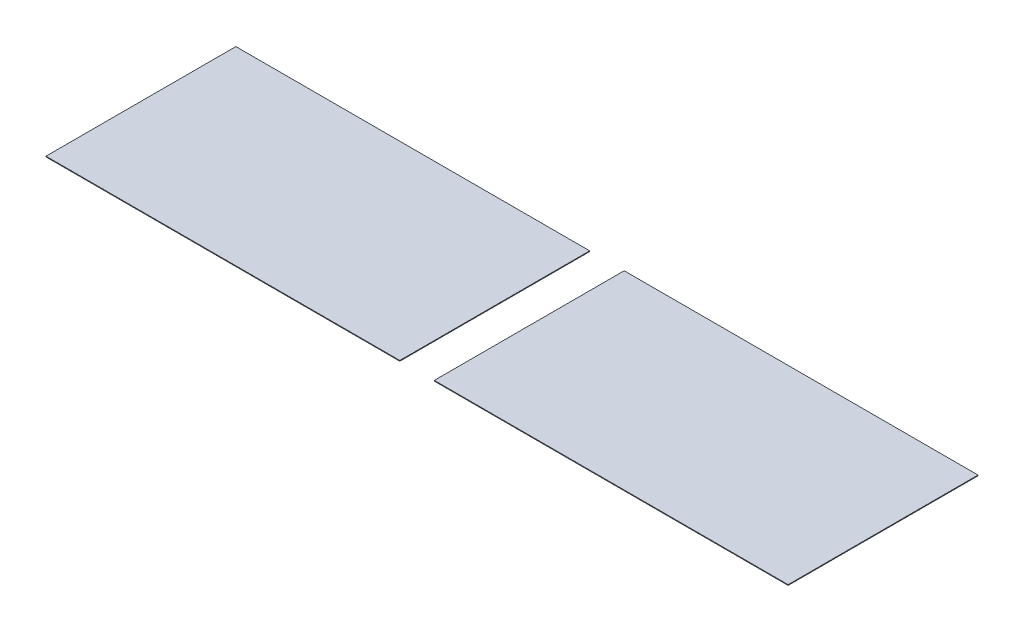
ISO-10303-21;
HEADER;
FILE_DESCRIPTION(('STEP AP214'),'2;1');
FILE_NAME('part.step','',(''),(''),'','','');
FILE_SCHEMA(('AUTOMOTIVE_DESIGN { 1 0 10303 214 1 1 1 1 }'));
ENDSEC;
DATA;
#1=APPLICATION_CONTEXT('core data for automotive mechanical design processes');
#2=APPLICATION_PROTOCOL_DEFINITION('international standard','automotive_design',2000,#1);
#3=PRODUCT_CONTEXT('',#1,'mechanical');
#4=PRODUCT('Part','Part','',(#3));
#5=PRODUCT_RELATED_PRODUCT_CATEGORY('part','',(#4));
#6=PRODUCT_DEFINITION_FORMATION('','',#4);
#7=PRODUCT_DEFINITION_CONTEXT('part definition',#1,'design');
#8=PRODUCT_DEFINITION('design','',#6,#7);
#9=PRODUCT_DEFINITION_SHAPE('','',#8);
#10=(LENGTH_UNIT() NAMED_UNIT(*) SI_UNIT(.MILLI.,.METRE.));
#11=(NAMED_UNIT(*) PLANE_ANGLE_UNIT() SI_UNIT($,.RADIAN.));
#12=(NAMED_UNIT(*) SI_UNIT($,.STERADIAN.) SOLID_ANGLE_UNIT());
#13=UNCERTAINTY_MEASURE_WITH_UNIT(LENGTH_MEASURE(1.E-05),#10,'distance_accuracy_value','');
#14=(GEOMETRIC_REPRESENTATION_CONTEXT(3) GLOBAL_UNCERTAINTY_ASSIGNED_CONTEXT((#13)) GLOBAL_UNIT_ASSIGNED_CONTEXT((#10,
#11,#12)) REPRESENTATION_CONTEXT('',''));
#15=CARTESIAN_POINT('',(0.,0.,0.));
#16=DIRECTION('',(0.,0.,1.));
#17=DIRECTION('',(1.,0.,0.));
#18=AXIS2_PLACEMENT_3D('',#15,#16,#17);
#19=CARTESIAN_POINT('',(22.5,0.04,0.));
#20=DIRECTION('',(1.,0.,0.));
#21=DIRECTION('',(0.,0.,-1.));
#22=AXIS2_PLACEMENT_3D('',#19,#20,#21);
#23=PLANE('',#22);
#24=DIRECTION('',(0.,0.,1.));
#25=VECTOR('',#24,1.);
#26=CARTESIAN_POINT('',(22.5,0.,0.));
#27=LINE('',#26,#25);
#28=CARTESIAN_POINT('',(22.5,0.,-11.));
#29=VERTEX_POINT('',#28);
#30=CARTESIAN_POINT('',(22.5,0.,0.));
#31=VERTEX_POINT('',#30);
#32=EDGE_CURVE('E110',#29,#31,#27,.T.);
#33=ORIENTED_EDGE('',*,*,#32,.T.);
#34=DIRECTION('',(0.,-1.,0.));
#35=VECTOR('',#34,1.);
#36=CARTESIAN_POINT('',(22.5,0.04,0.));
#37=LINE('',#36,#35);
#38=CARTESIAN_POINT('',(22.5,0.04,0.));
#39=VERTEX_POINT('',#38);
#40=EDGE_CURVE('E12',#39,#31,#37,.T.);
#41=ORIENTED_EDGE('',*,*,#40,.F.);
#42=DIRECTION('',(0.,0.,1.));
#43=VECTOR('',#42,1.);
#44=CARTESIAN_POINT('',(22.5,0.04,0.));
#45=LINE('',#44,#43);
#46=CARTESIAN_POINT('',(22.5,0.04,-11.));
#47=VERTEX_POINT('',#46);
#48=EDGE_CURVE('E98',#47,#39,#45,.T.);
#49=ORIENTED_EDGE('',*,*,#48,.F.);
#50=DIRECTION('',(0.,-1.,0.));
#51=VECTOR('',#50,1.);
#52=CARTESIAN_POINT('',(22.5,0.04,-11.));
#53=LINE('',#52,#51);
#54=EDGE_CURVE('E106',#47,#29,#53,.T.);
#55=ORIENTED_EDGE('',*,*,#54,.T.);
#56=EDGE_LOOP('',(#33,#41,#49,#55));
#57=FACE_BOUND('',#56,.T.);
#58=ADVANCED_FACE('F47',(#57),#23,.F.);
#59=CARTESIAN_POINT('',(22.5,0.04,0.));
#60=DIRECTION('',(0.,0.,-1.));
#61=DIRECTION('',(-1.,0.,0.));
#62=AXIS2_PLACEMENT_3D('',#59,#60,#61);
#63=PLANE('',#62);
#64=DIRECTION('',(1.,0.,0.));
#65=VECTOR('',#64,1.);
#66=CARTESIAN_POINT('',(22.5,0.,0.));
#67=LINE('',#66,#65);
#68=CARTESIAN_POINT('',(43.,0.,0.));
#69=VERTEX_POINT('',#68);
#70=EDGE_CURVE('E102',#31,#69,#67,.T.);
#71=ORIENTED_EDGE('',*,*,#70,.T.);
#72=DIRECTION('',(0.,-1.,0.));
#73=VECTOR('',#72,1.);
#74=CARTESIAN_POINT('',(43.,0.04,0.));
#75=LINE('',#74,#73);
#76=CARTESIAN_POINT('',(43.,0.04,0.));
#77=VERTEX_POINT('',#76);
#78=EDGE_CURVE('E55',#77,#69,#75,.T.);
#79=ORIENTED_EDGE('',*,*,#78,.F.);
#80=DIRECTION('',(1.,0.,0.));
#81=VECTOR('',#80,1.);
#82=CARTESIAN_POINT('',(22.5,0.04,0.));
#83=LINE('',#82,#81);
#84=EDGE_CURVE('E93',#39,#77,#83,.T.);
#85=ORIENTED_EDGE('',*,*,#84,.F.);
#86=ORIENTED_EDGE('',*,*,#40,.T.);
#87=EDGE_LOOP('',(#71,#79,#85,#86));
#88=FACE_BOUND('',#87,.T.);
#89=ADVANCED_FACE('F101',(#88),#63,.F.);
#90=CARTESIAN_POINT('',(43.,0.04,0.));
#91=DIRECTION('',(-1.,0.,0.));
#92=DIRECTION('',(0.,0.,1.));
#93=AXIS2_PLACEMENT_3D('',#90,#91,#92);
#94=PLANE('',#93);
#95=DIRECTION('',(0.,0.,-1.));
#96=VECTOR('',#95,1.);
#97=CARTESIAN_POINT('',(43.,0.,0.));
#98=LINE('',#97,#96);
#99=CARTESIAN_POINT('',(43.,0.,-11.));
#100=VERTEX_POINT('',#99);
#101=EDGE_CURVE('E80',#69,#100,#98,.T.);
#102=ORIENTED_EDGE('',*,*,#101,.T.);
#103=DIRECTION('',(0.,-1.,0.));
#104=VECTOR('',#103,1.);
#105=CARTESIAN_POINT('',(43.,0.04,-11.));
#106=LINE('',#105,#104);
#107=CARTESIAN_POINT('',(43.,0.04,-11.));
#108=VERTEX_POINT('',#107);
#109=EDGE_CURVE('E103',#108,#100,#106,.T.);
#110=ORIENTED_EDGE('',*,*,#109,.F.);
#111=DIRECTION('',(0.,0.,-1.));
#112=VECTOR('',#111,1.);
#113=CARTESIAN_POINT('',(43.,0.04,0.));
#114=LINE('',#113,#112);
#115=EDGE_CURVE('E96',#77,#108,#114,.T.);
#116=ORIENTED_EDGE('',*,*,#115,.F.);
#117=ORIENTED_EDGE('',*,*,#78,.T.);
#118=EDGE_LOOP('',(#102,#110,#116,#117));
#119=FACE_BOUND('',#118,.T.);
#120=ADVANCED_FACE('F104',(#119),#94,.F.);
#121=CARTESIAN_POINT('',(22.5,0.04,-11.));
#122=DIRECTION('',(0.,0.,1.));
#123=DIRECTION('',(1.,0.,0.));
#124=AXIS2_PLACEMENT_3D('',#121,#122,#123);
#125=PLANE('',#124);
#126=DIRECTION('',(-1.,0.,0.));
#127=VECTOR('',#126,1.);
#128=CARTESIAN_POINT('',(22.5,0.,-11.));
#129=LINE('',#128,#127);
#130=EDGE_CURVE('E86',#100,#29,#129,.T.);
#131=ORIENTED_EDGE('',*,*,#130,.T.);
#132=ORIENTED_EDGE('',*,*,#54,.F.);
#133=DIRECTION('',(-1.,0.,0.));
#134=VECTOR('',#133,1.);
#135=CARTESIAN_POINT('',(22.5,0.04,-11.));
#136=LINE('',#135,#134);
#137=EDGE_CURVE('E63',#108,#47,#136,.T.);
#138=ORIENTED_EDGE('',*,*,#137,.F.);
#139=ORIENTED_EDGE('',*,*,#109,.T.);
#140=EDGE_LOOP('',(#131,#132,#138,#139));
#141=FACE_BOUND('',#140,.T.);
#142=ADVANCED_FACE('F117',(#141),#125,.F.);
#143=CARTESIAN_POINT('',(0.,0.04,0.));
#144=DIRECTION('',(0.,-1.,0.));
#145=DIRECTION('',(0.,0.,-1.));
#146=AXIS2_PLACEMENT_3D('',#143,#144,#145);
#147=PLANE('',#146);
#148=ORIENTED_EDGE('',*,*,#48,.T.);
#149=ORIENTED_EDGE('',*,*,#84,.T.);
#150=ORIENTED_EDGE('',*,*,#115,.T.);
#151=ORIENTED_EDGE('',*,*,#137,.T.);
#152=EDGE_LOOP('',(#148,#149,#150,#151));
#153=FACE_BOUND('',#152,.T.);
#154=ADVANCED_FACE('F94',(#153),#147,.F.);
#155=CARTESIAN_POINT('',(0.,0.,0.));
#156=DIRECTION('',(0.,-1.,0.));
#157=DIRECTION('',(0.,0.,-1.));
#158=AXIS2_PLACEMENT_3D('',#155,#156,#157);
#159=PLANE('',#158);
#160=ORIENTED_EDGE('',*,*,#32,.F.);
#161=ORIENTED_EDGE('',*,*,#130,.F.);
#162=ORIENTED_EDGE('',*,*,#101,.F.);
#163=ORIENTED_EDGE('',*,*,#70,.F.);
#164=EDGE_LOOP('',(#160,#161,#162,#163));
#165=FACE_BOUND('',#164,.T.);
#166=ADVANCED_FACE('F120',(#165),#159,.T.);
#167=CLOSED_SHELL('',(#58,#89,#120,#142,#154,#166));
#168=MANIFOLD_SOLID_BREP('B2',#167);
#169=CARTESIAN_POINT('',(0.,0.04,0.));
#170=DIRECTION('',(1.,0.,0.));
#171=DIRECTION('',(0.,0.,-1.));
#172=AXIS2_PLACEMENT_3D('',#169,#170,#171);
#173=PLANE('',#172);
#174=DIRECTION('',(0.,0.,1.));
#175=VECTOR('',#174,1.);
#176=CARTESIAN_POINT('',(0.,0.,0.));
#177=LINE('',#176,#175);
#178=CARTESIAN_POINT('',(0.,0.,-11.));
#179=VERTEX_POINT('',#178);
#180=CARTESIAN_POINT('',(0.,0.,0.));
#181=VERTEX_POINT('',#180);
#182=EDGE_CURVE('E234',#179,#181,#177,.T.);
#183=ORIENTED_EDGE('',*,*,#182,.T.);
#184=DIRECTION('',(0.,-1.,0.));
#185=VECTOR('',#184,1.);
#186=CARTESIAN_POINT('',(0.,0.04,0.));
#187=LINE('',#186,#185);
#188=CARTESIAN_POINT('',(0.,0.04,0.));
#189=VERTEX_POINT('',#188);
#190=EDGE_CURVE('E45',#189,#181,#187,.T.);
#191=ORIENTED_EDGE('',*,*,#190,.F.);
#192=DIRECTION('',(0.,0.,1.));
#193=VECTOR('',#192,1.);
#194=CARTESIAN_POINT('',(0.,0.04,0.));
#195=LINE('',#194,#193);
#196=CARTESIAN_POINT('',(0.,0.04,-11.));
#197=VERTEX_POINT('',#196);
#198=EDGE_CURVE('E222',#197,#189,#195,.T.);
#199=ORIENTED_EDGE('',*,*,#198,.F.);
#200=DIRECTION('',(0.,-1.,0.));
#201=VECTOR('',#200,1.);
#202=CARTESIAN_POINT('',(0.,0.04,-11.));
#203=LINE('',#202,#201);
#204=EDGE_CURVE('E230',#197,#179,#203,.T.);
#205=ORIENTED_EDGE('',*,*,#204,.T.);
#206=EDGE_LOOP('',(#183,#191,#199,#205));
#207=FACE_BOUND('',#206,.T.);
#208=ADVANCED_FACE('F171',(#207),#173,.F.);
#209=CARTESIAN_POINT('',(0.,0.04,0.));
#210=DIRECTION('',(0.,0.,-1.));
#211=DIRECTION('',(-1.,0.,0.));
#212=AXIS2_PLACEMENT_3D('',#209,#210,#211);
#213=PLANE('',#212);
#214=DIRECTION('',(1.,0.,0.));
#215=VECTOR('',#214,1.);
#216=CARTESIAN_POINT('',(0.,0.,0.));
#217=LINE('',#216,#215);
#218=CARTESIAN_POINT('',(20.5,0.,0.));
#219=VERTEX_POINT('',#218);
#220=EDGE_CURVE('E226',#181,#219,#217,.T.);
#221=ORIENTED_EDGE('',*,*,#220,.T.);
#222=DIRECTION('',(0.,-1.,0.));
#223=VECTOR('',#222,1.);
#224=CARTESIAN_POINT('',(20.5,0.04,0.));
#225=LINE('',#224,#223);
#226=CARTESIAN_POINT('',(20.5,0.04,0.));
#227=VERTEX_POINT('',#226);
#228=EDGE_CURVE('E179',#227,#219,#225,.T.);
#229=ORIENTED_EDGE('',*,*,#228,.F.);
#230=DIRECTION('',(1.,0.,0.));
#231=VECTOR('',#230,1.);
#232=CARTESIAN_POINT('',(0.,0.04,0.));
#233=LINE('',#232,#231);
#234=EDGE_CURVE('E217',#189,#227,#233,.T.);
#235=ORIENTED_EDGE('',*,*,#234,.F.);
#236=ORIENTED_EDGE('',*,*,#190,.T.);
#237=EDGE_LOOP('',(#221,#229,#235,#236));
#238=FACE_BOUND('',#237,.T.);
#239=ADVANCED_FACE('F225',(#238),#213,.F.);
#240=CARTESIAN_POINT('',(20.5,0.04,0.));
#241=DIRECTION('',(-1.,0.,0.));
#242=DIRECTION('',(0.,0.,1.));
#243=AXIS2_PLACEMENT_3D('',#240,#241,#242);
#244=PLANE('',#243);
#245=DIRECTION('',(0.,0.,-1.));
#246=VECTOR('',#245,1.);
#247=CARTESIAN_POINT('',(20.5,0.,0.));
#248=LINE('',#247,#246);
#249=CARTESIAN_POINT('',(20.5,0.,-11.));
#250=VERTEX_POINT('',#249);
#251=EDGE_CURVE('E204',#219,#250,#248,.T.);
#252=ORIENTED_EDGE('',*,*,#251,.T.);
#253=DIRECTION('',(0.,-1.,0.));
#254=VECTOR('',#253,1.);
#255=CARTESIAN_POINT('',(20.5,0.04,-11.));
#256=LINE('',#255,#254);
#257=CARTESIAN_POINT('',(20.5,0.04,-11.));
#258=VERTEX_POINT('',#257);
#259=EDGE_CURVE('E227',#258,#250,#256,.T.);
#260=ORIENTED_EDGE('',*,*,#259,.F.);
#261=DIRECTION('',(0.,0.,-1.));
#262=VECTOR('',#261,1.);
#263=CARTESIAN_POINT('',(20.5,0.04,0.));
#264=LINE('',#263,#262);
#265=EDGE_CURVE('E220',#227,#258,#264,.T.);
#266=ORIENTED_EDGE('',*,*,#265,.F.);
#267=ORIENTED_EDGE('',*,*,#228,.T.);
#268=EDGE_LOOP('',(#252,#260,#266,#267));
#269=FACE_BOUND('',#268,.T.);
#270=ADVANCED_FACE('F228',(#269),#244,.F.);
#271=CARTESIAN_POINT('',(0.,0.04,-11.));
#272=DIRECTION('',(0.,0.,1.));
#273=DIRECTION('',(1.,0.,0.));
#274=AXIS2_PLACEMENT_3D('',#271,#272,#273);
#275=PLANE('',#274);
#276=DIRECTION('',(-1.,0.,0.));
#277=VECTOR('',#276,1.);
#278=CARTESIAN_POINT('',(0.,0.,-11.));
#279=LINE('',#278,#277);
#280=EDGE_CURVE('E210',#250,#179,#279,.T.);
#281=ORIENTED_EDGE('',*,*,#280,.T.);
#282=ORIENTED_EDGE('',*,*,#204,.F.);
#283=DIRECTION('',(-1.,0.,0.));
#284=VECTOR('',#283,1.);
#285=CARTESIAN_POINT('',(0.,0.04,-11.));
#286=LINE('',#285,#284);
#287=EDGE_CURVE('E187',#258,#197,#286,.T.);
#288=ORIENTED_EDGE('',*,*,#287,.F.);
#289=ORIENTED_EDGE('',*,*,#259,.T.);
#290=EDGE_LOOP('',(#281,#282,#288,#289));
#291=FACE_BOUND('',#290,.T.);
#292=ADVANCED_FACE('F241',(#291),#275,.F.);
#293=CARTESIAN_POINT('',(0.,0.04,0.));
#294=DIRECTION('',(0.,-1.,0.));
#295=DIRECTION('',(0.,0.,-1.));
#296=AXIS2_PLACEMENT_3D('',#293,#294,#295);
#297=PLANE('',#296);
#298=ORIENTED_EDGE('',*,*,#198,.T.);
#299=ORIENTED_EDGE('',*,*,#234,.T.);
#300=ORIENTED_EDGE('',*,*,#265,.T.);
#301=ORIENTED_EDGE('',*,*,#287,.T.);
#302=EDGE_LOOP('',(#298,#299,#300,#301));
#303=FACE_BOUND('',#302,.T.);
#304=ADVANCED_FACE('F218',(#303),#297,.F.);
#305=CARTESIAN_POINT('',(0.,0.,0.));
#306=DIRECTION('',(0.,-1.,0.));
#307=DIRECTION('',(0.,0.,-1.));
#308=AXIS2_PLACEMENT_3D('',#305,#306,#307);
#309=PLANE('',#308);
#310=ORIENTED_EDGE('',*,*,#182,.F.);
#311=ORIENTED_EDGE('',*,*,#280,.F.);
#312=ORIENTED_EDGE('',*,*,#251,.F.);
#313=ORIENTED_EDGE('',*,*,#220,.F.);
#314=EDGE_LOOP('',(#310,#311,#312,#313));
#315=FACE_BOUND('',#314,.T.);
#316=ADVANCED_FACE('F244',(#315),#309,.T.);
#317=CLOSED_SHELL('',(#208,#239,#270,#292,#304,#316));
#318=MANIFOLD_SOLID_BREP('B6',#317);
#319=ADVANCED_BREP_SHAPE_REPRESENTATION('',(#18,#168,#318),#14);
#320=SHAPE_DEFINITION_REPRESENTATION(#9,#319);
ENDSEC;
END-ISO-10303-21;
